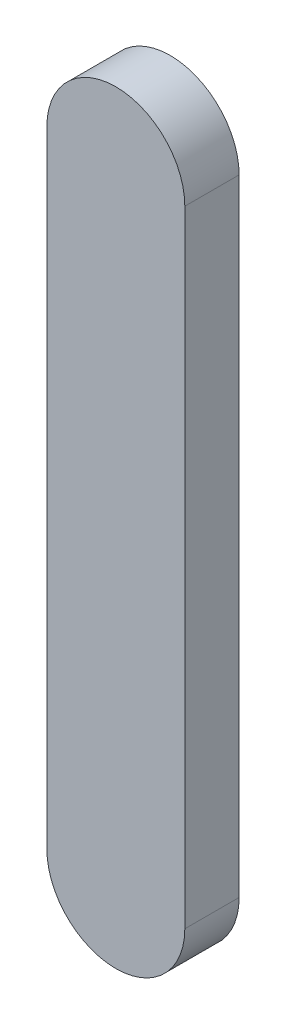
ISO-10303-21;
HEADER;
FILE_DESCRIPTION(('STEP AP214'),'2;1');
FILE_NAME('part.step','',(''),(''),'','','');
FILE_SCHEMA(('AUTOMOTIVE_DESIGN { 1 0 10303 214 1 1 1 1 }'));
ENDSEC;
DATA;
#1=APPLICATION_CONTEXT('core data for automotive mechanical design processes');
#2=APPLICATION_PROTOCOL_DEFINITION('international standard','automotive_design',2000,#1);
#3=PRODUCT_CONTEXT('',#1,'mechanical');
#4=PRODUCT('Part','Part','',(#3));
#5=PRODUCT_RELATED_PRODUCT_CATEGORY('part','',(#4));
#6=PRODUCT_DEFINITION_FORMATION('','',#4);
#7=PRODUCT_DEFINITION_CONTEXT('part definition',#1,'design');
#8=PRODUCT_DEFINITION('design','',#6,#7);
#9=PRODUCT_DEFINITION_SHAPE('','',#8);
#10=(LENGTH_UNIT() NAMED_UNIT(*) SI_UNIT(.MILLI.,.METRE.));
#11=(NAMED_UNIT(*) PLANE_ANGLE_UNIT() SI_UNIT($,.RADIAN.));
#12=(NAMED_UNIT(*) SI_UNIT($,.STERADIAN.) SOLID_ANGLE_UNIT());
#13=UNCERTAINTY_MEASURE_WITH_UNIT(LENGTH_MEASURE(1.E-05),#10,'distance_accuracy_value','');
#14=(GEOMETRIC_REPRESENTATION_CONTEXT(3) GLOBAL_UNCERTAINTY_ASSIGNED_CONTEXT((#13)) GLOBAL_UNIT_ASSIGNED_CONTEXT((#10,
#11,#12)) REPRESENTATION_CONTEXT('',''));
#15=CARTESIAN_POINT('',(0.,0.,0.));
#16=DIRECTION('',(0.,0.,1.));
#17=DIRECTION('',(1.,0.,0.));
#18=AXIS2_PLACEMENT_3D('',#15,#16,#17);
#19=CARTESIAN_POINT('',(130.81,107.5436,0.));
#20=DIRECTION('',(-1.,0.,0.));
#21=DIRECTION('',(0.,1.,0.));
#22=AXIS2_PLACEMENT_3D('',#19,#20,#21);
#23=PLANE('',#22);
#24=DIRECTION('',(0.,1.,0.));
#25=VECTOR('',#24,1.);
#26=CARTESIAN_POINT('',(130.81,107.5436,0.1999996));
#27=LINE('',#26,#25);
#28=CARTESIAN_POINT('',(130.81,107.5436,0.1999996));
#29=VERTEX_POINT('',#28);
#30=CARTESIAN_POINT('',(130.81,109.8477356,0.1999996));
#31=VERTEX_POINT('',#30);
#32=EDGE_CURVE('E11',#29,#31,#27,.T.);
#33=ORIENTED_EDGE('',*,*,#32,.F.);
#34=DIRECTION('',(0.,0.,1.));
#35=VECTOR('',#34,1.);
#36=CARTESIAN_POINT('',(130.81,107.5436,0.));
#37=LINE('',#36,#35);
#38=CARTESIAN_POINT('',(130.81,107.5436,0.));
#39=VERTEX_POINT('',#38);
#40=EDGE_CURVE('E24',#39,#29,#37,.T.);
#41=ORIENTED_EDGE('',*,*,#40,.F.);
#42=DIRECTION('',(0.,1.,0.));
#43=VECTOR('',#42,1.);
#44=CARTESIAN_POINT('',(130.81,107.5436,0.));
#45=LINE('',#44,#43);
#46=CARTESIAN_POINT('',(130.81,109.8477356,0.));
#47=VERTEX_POINT('',#46);
#48=EDGE_CURVE('E75',#39,#47,#45,.T.);
#49=ORIENTED_EDGE('',*,*,#48,.T.);
#50=DIRECTION('',(0.,0.,1.));
#51=VECTOR('',#50,1.);
#52=CARTESIAN_POINT('',(130.81,109.8477356,0.));
#53=LINE('',#52,#51);
#54=EDGE_CURVE('E37',#47,#31,#53,.T.);
#55=ORIENTED_EDGE('',*,*,#54,.T.);
#56=EDGE_LOOP('',(#33,#41,#49,#55));
#57=FACE_BOUND('',#56,.T.);
#58=ADVANCED_FACE('F17',(#57),#23,.F.);
#59=CARTESIAN_POINT('',(130.556,109.8477356,0.));
#60=DIRECTION('',(0.,0.,-1.));
#61=DIRECTION('',(1.,0.,0.));
#62=AXIS2_PLACEMENT_3D('',#59,#60,#61);
#63=CYLINDRICAL_SURFACE('',#62,0.254);
#64=CARTESIAN_POINT('',(130.556,109.8477356,0.1999996));
#65=DIRECTION('',(0.,0.,1.));
#66=DIRECTION('',(1.,0.,0.));
#67=AXIS2_PLACEMENT_3D('',#64,#65,#66);
#68=CIRCLE('',#67,0.254);
#69=CARTESIAN_POINT('',(130.302,109.8477356,0.1999996));
#70=VERTEX_POINT('',#69);
#71=EDGE_CURVE('E83',#31,#70,#68,.T.);
#72=ORIENTED_EDGE('',*,*,#71,.F.);
#73=ORIENTED_EDGE('',*,*,#54,.F.);
#74=CARTESIAN_POINT('',(130.556,109.8477356,0.));
#75=DIRECTION('',(0.,0.,1.));
#76=DIRECTION('',(1.,0.,0.));
#77=AXIS2_PLACEMENT_3D('',#74,#75,#76);
#78=CIRCLE('',#77,0.254);
#79=CARTESIAN_POINT('',(130.302,109.8477356,0.));
#80=VERTEX_POINT('',#79);
#81=EDGE_CURVE('E81',#47,#80,#78,.T.);
#82=ORIENTED_EDGE('',*,*,#81,.T.);
#83=DIRECTION('',(0.,0.,1.));
#84=VECTOR('',#83,1.);
#85=CARTESIAN_POINT('',(130.302,109.8477356,0.));
#86=LINE('',#85,#84);
#87=EDGE_CURVE('E67',#80,#70,#86,.T.);
#88=ORIENTED_EDGE('',*,*,#87,.T.);
#89=EDGE_LOOP('',(#72,#73,#82,#88));
#90=FACE_BOUND('',#89,.T.);
#91=ADVANCED_FACE('F89',(#90),#63,.T.);
#92=CARTESIAN_POINT('',(130.302,109.8477356,0.));
#93=DIRECTION('',(1.,0.,0.));
#94=DIRECTION('',(0.,-1.,0.));
#95=AXIS2_PLACEMENT_3D('',#92,#93,#94);
#96=PLANE('',#95);
#97=DIRECTION('',(0.,-1.,0.));
#98=VECTOR('',#97,1.);
#99=CARTESIAN_POINT('',(130.302,109.8477356,0.1999996));
#100=LINE('',#99,#98);
#101=CARTESIAN_POINT('',(130.302,107.5436,0.1999996));
#102=VERTEX_POINT('',#101);
#103=EDGE_CURVE('E71',#70,#102,#100,.T.);
#104=ORIENTED_EDGE('',*,*,#103,.F.);
#105=ORIENTED_EDGE('',*,*,#87,.F.);
#106=DIRECTION('',(0.,-1.,0.));
#107=VECTOR('',#106,1.);
#108=CARTESIAN_POINT('',(130.302,109.8477356,0.));
#109=LINE('',#108,#107);
#110=CARTESIAN_POINT('',(130.302,107.5436,0.));
#111=VERTEX_POINT('',#110);
#112=EDGE_CURVE('E63',#80,#111,#109,.T.);
#113=ORIENTED_EDGE('',*,*,#112,.T.);
#114=DIRECTION('',(0.,0.,1.));
#115=VECTOR('',#114,1.);
#116=CARTESIAN_POINT('',(130.302,107.5436,0.));
#117=LINE('',#116,#115);
#118=EDGE_CURVE('E53',#111,#102,#117,.T.);
#119=ORIENTED_EDGE('',*,*,#118,.T.);
#120=EDGE_LOOP('',(#104,#105,#113,#119));
#121=FACE_BOUND('',#120,.T.);
#122=ADVANCED_FACE('F66',(#121),#96,.F.);
#123=CARTESIAN_POINT('',(130.556,107.5436,0.));
#124=DIRECTION('',(0.,0.,-1.));
#125=DIRECTION('',(-1.,0.,0.));
#126=AXIS2_PLACEMENT_3D('',#123,#124,#125);
#127=CYLINDRICAL_SURFACE('',#126,0.254);
#128=CARTESIAN_POINT('',(130.556,107.5436,0.1999996));
#129=DIRECTION('',(0.,0.,1.));
#130=DIRECTION('',(-1.,0.,0.));
#131=AXIS2_PLACEMENT_3D('',#128,#129,#130);
#132=CIRCLE('',#131,0.254);
#133=EDGE_CURVE('E59',#102,#29,#132,.T.);
#134=ORIENTED_EDGE('',*,*,#133,.F.);
#135=ORIENTED_EDGE('',*,*,#118,.F.);
#136=CARTESIAN_POINT('',(130.556,107.5436,0.));
#137=DIRECTION('',(0.,0.,1.));
#138=DIRECTION('',(-1.,0.,0.));
#139=AXIS2_PLACEMENT_3D('',#136,#137,#138);
#140=CIRCLE('',#139,0.254);
#141=EDGE_CURVE('E57',#111,#39,#140,.T.);
#142=ORIENTED_EDGE('',*,*,#141,.T.);
#143=ORIENTED_EDGE('',*,*,#40,.T.);
#144=EDGE_LOOP('',(#134,#135,#142,#143));
#145=FACE_BOUND('',#144,.T.);
#146=ADVANCED_FACE('F55',(#145),#127,.T.);
#147=CARTESIAN_POINT('',(130.81,107.5436,0.));
#148=DIRECTION('',(0.,0.,-1.));
#149=DIRECTION('',(-1.,0.,0.));
#150=AXIS2_PLACEMENT_3D('',#147,#148,#149);
#151=PLANE('',#150);
#152=ORIENTED_EDGE('',*,*,#141,.F.);
#153=ORIENTED_EDGE('',*,*,#112,.F.);
#154=ORIENTED_EDGE('',*,*,#81,.F.);
#155=ORIENTED_EDGE('',*,*,#48,.F.);
#156=EDGE_LOOP('',(#152,#153,#154,#155));
#157=FACE_BOUND('',#156,.T.);
#158=ADVANCED_FACE('F74',(#157),#151,.T.);
#159=CARTESIAN_POINT('',(130.81,107.5436,0.1999996));
#160=DIRECTION('',(0.,0.,-1.));
#161=DIRECTION('',(-1.,0.,0.));
#162=AXIS2_PLACEMENT_3D('',#159,#160,#161);
#163=PLANE('',#162);
#164=ORIENTED_EDGE('',*,*,#32,.T.);
#165=ORIENTED_EDGE('',*,*,#71,.T.);
#166=ORIENTED_EDGE('',*,*,#103,.T.);
#167=ORIENTED_EDGE('',*,*,#133,.T.);
#168=EDGE_LOOP('',(#164,#165,#166,#167));
#169=FACE_BOUND('',#168,.T.);
#170=ADVANCED_FACE('F91',(#169),#163,.F.);
#171=CLOSED_SHELL('',(#58,#91,#122,#146,#158,#170));
#172=MANIFOLD_SOLID_BREP('B1',#171);
#173=ADVANCED_BREP_SHAPE_REPRESENTATION('',(#18,#172),#14);
#174=SHAPE_DEFINITION_REPRESENTATION(#9,#173);
ENDSEC;
END-ISO-10303-21;
